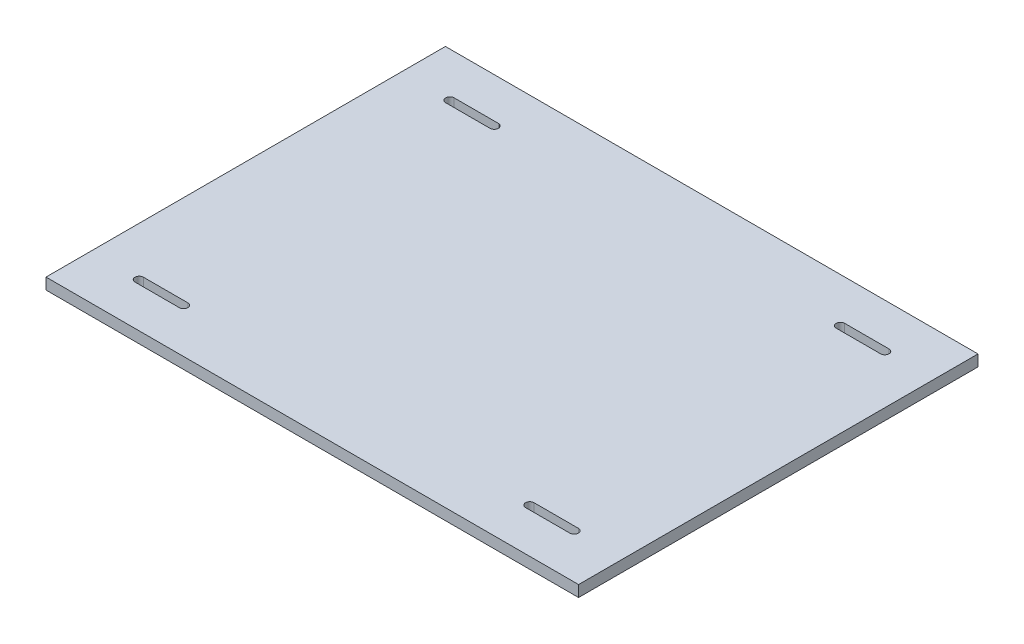
ISO-10303-21;
HEADER;
FILE_DESCRIPTION(('STEP AP214'),'2;1');
FILE_NAME('part.step','',(''),(''),'','','');
FILE_SCHEMA(('AUTOMOTIVE_DESIGN { 1 0 10303 214 1 1 1 1 }'));
ENDSEC;
DATA;
#1=APPLICATION_CONTEXT('core data for automotive mechanical design processes');
#2=APPLICATION_PROTOCOL_DEFINITION('international standard','automotive_design',2000,#1);
#3=PRODUCT_CONTEXT('',#1,'mechanical');
#4=PRODUCT('Part','Part','',(#3));
#5=PRODUCT_RELATED_PRODUCT_CATEGORY('part','',(#4));
#6=PRODUCT_DEFINITION_FORMATION('','',#4);
#7=PRODUCT_DEFINITION_CONTEXT('part definition',#1,'design');
#8=PRODUCT_DEFINITION('design','',#6,#7);
#9=PRODUCT_DEFINITION_SHAPE('','',#8);
#10=(LENGTH_UNIT() NAMED_UNIT(*) SI_UNIT(.MILLI.,.METRE.));
#11=(NAMED_UNIT(*) PLANE_ANGLE_UNIT() SI_UNIT($,.RADIAN.));
#12=(NAMED_UNIT(*) SI_UNIT($,.STERADIAN.) SOLID_ANGLE_UNIT());
#13=UNCERTAINTY_MEASURE_WITH_UNIT(LENGTH_MEASURE(1.E-05),#10,'distance_accuracy_value','');
#14=(GEOMETRIC_REPRESENTATION_CONTEXT(3) GLOBAL_UNCERTAINTY_ASSIGNED_CONTEXT((#13)) GLOBAL_UNIT_ASSIGNED_CONTEXT((#10,
#11,#12)) REPRESENTATION_CONTEXT('',''));
#15=CARTESIAN_POINT('',(0.,0.,0.));
#16=DIRECTION('',(0.,0.,1.));
#17=DIRECTION('',(1.,0.,0.));
#18=AXIS2_PLACEMENT_3D('',#15,#16,#17);
#19=CARTESIAN_POINT('',(600.,25.4,450.));
#20=DIRECTION('',(-1.,0.,0.));
#21=DIRECTION('',(0.,0.,1.));
#22=AXIS2_PLACEMENT_3D('',#19,#20,#21);
#23=PLANE('',#22);
#24=DIRECTION('',(0.,0.,-1.));
#25=VECTOR('',#24,1.);
#26=CARTESIAN_POINT('',(600.,0.,450.));
#27=LINE('',#26,#25);
#28=CARTESIAN_POINT('',(600.,0.,450.));
#29=VERTEX_POINT('',#28);
#30=CARTESIAN_POINT('',(600.,0.,-450.));
#31=VERTEX_POINT('',#30);
#32=EDGE_CURVE('E300',#29,#31,#27,.T.);
#33=ORIENTED_EDGE('',*,*,#32,.T.);
#34=DIRECTION('',(0.,-1.,0.));
#35=VECTOR('',#34,1.);
#36=CARTESIAN_POINT('',(600.,25.4,-450.));
#37=LINE('',#36,#35);
#38=CARTESIAN_POINT('',(600.,25.4,-450.));
#39=VERTEX_POINT('',#38);
#40=EDGE_CURVE('E11',#39,#31,#37,.T.);
#41=ORIENTED_EDGE('',*,*,#40,.F.);
#42=DIRECTION('',(0.,0.,-1.));
#43=VECTOR('',#42,1.);
#44=CARTESIAN_POINT('',(600.,25.4,450.));
#45=LINE('',#44,#43);
#46=CARTESIAN_POINT('',(600.,25.4,450.));
#47=VERTEX_POINT('',#46);
#48=EDGE_CURVE('E307',#47,#39,#45,.T.);
#49=ORIENTED_EDGE('',*,*,#48,.F.);
#50=DIRECTION('',(0.,-1.,0.));
#51=VECTOR('',#50,1.);
#52=CARTESIAN_POINT('',(600.,25.4,450.));
#53=LINE('',#52,#51);
#54=EDGE_CURVE('E317',#47,#29,#53,.T.);
#55=ORIENTED_EDGE('',*,*,#54,.T.);
#56=EDGE_LOOP('',(#33,#41,#49,#55));
#57=FACE_BOUND('',#56,.T.);
#58=ADVANCED_FACE('F37',(#57),#23,.F.);
#59=CARTESIAN_POINT('',(-600.,25.4,-450.));
#60=DIRECTION('',(0.,0.,1.));
#61=DIRECTION('',(1.,0.,0.));
#62=AXIS2_PLACEMENT_3D('',#59,#60,#61);
#63=PLANE('',#62);
#64=DIRECTION('',(-1.,0.,0.));
#65=VECTOR('',#64,1.);
#66=CARTESIAN_POINT('',(-600.,0.,-450.));
#67=LINE('',#66,#65);
#68=CARTESIAN_POINT('',(-600.,0.,-450.));
#69=VERTEX_POINT('',#68);
#70=EDGE_CURVE('E320',#31,#69,#67,.T.);
#71=ORIENTED_EDGE('',*,*,#70,.T.);
#72=DIRECTION('',(0.,-1.,0.));
#73=VECTOR('',#72,1.);
#74=CARTESIAN_POINT('',(-600.,25.4,-450.));
#75=LINE('',#74,#73);
#76=CARTESIAN_POINT('',(-600.,25.4,-450.));
#77=VERTEX_POINT('',#76);
#78=EDGE_CURVE('E44',#77,#69,#75,.T.);
#79=ORIENTED_EDGE('',*,*,#78,.F.);
#80=DIRECTION('',(-1.,0.,0.));
#81=VECTOR('',#80,1.);
#82=CARTESIAN_POINT('',(-600.,25.4,-450.));
#83=LINE('',#82,#81);
#84=EDGE_CURVE('E310',#39,#77,#83,.T.);
#85=ORIENTED_EDGE('',*,*,#84,.F.);
#86=ORIENTED_EDGE('',*,*,#40,.T.);
#87=EDGE_LOOP('',(#71,#79,#85,#86));
#88=FACE_BOUND('',#87,.T.);
#89=ADVANCED_FACE('F349',(#88),#63,.F.);
#90=CARTESIAN_POINT('',(-600.,25.4,450.));
#91=DIRECTION('',(1.,0.,0.));
#92=DIRECTION('',(0.,0.,-1.));
#93=AXIS2_PLACEMENT_3D('',#90,#91,#92);
#94=PLANE('',#93);
#95=DIRECTION('',(0.,0.,1.));
#96=VECTOR('',#95,1.);
#97=CARTESIAN_POINT('',(-600.,0.,450.));
#98=LINE('',#97,#96);
#99=CARTESIAN_POINT('',(-600.,0.,450.));
#100=VERTEX_POINT('',#99);
#101=EDGE_CURVE('E322',#69,#100,#98,.T.);
#102=ORIENTED_EDGE('',*,*,#101,.T.);
#103=DIRECTION('',(0.,-1.,0.));
#104=VECTOR('',#103,1.);
#105=CARTESIAN_POINT('',(-600.,25.4,450.));
#106=LINE('',#105,#104);
#107=CARTESIAN_POINT('',(-600.,25.4,450.));
#108=VERTEX_POINT('',#107);
#109=EDGE_CURVE('E327',#108,#100,#106,.T.);
#110=ORIENTED_EDGE('',*,*,#109,.F.);
#111=DIRECTION('',(0.,0.,1.));
#112=VECTOR('',#111,1.);
#113=CARTESIAN_POINT('',(-600.,25.4,450.));
#114=LINE('',#113,#112);
#115=EDGE_CURVE('E313',#77,#108,#114,.T.);
#116=ORIENTED_EDGE('',*,*,#115,.F.);
#117=ORIENTED_EDGE('',*,*,#78,.T.);
#118=EDGE_LOOP('',(#102,#110,#116,#117));
#119=FACE_BOUND('',#118,.T.);
#120=ADVANCED_FACE('F334',(#119),#94,.F.);
#121=CARTESIAN_POINT('',(-600.,25.4,450.));
#122=DIRECTION('',(0.,0.,-1.));
#123=DIRECTION('',(-1.,0.,0.));
#124=AXIS2_PLACEMENT_3D('',#121,#122,#123);
#125=PLANE('',#124);
#126=DIRECTION('',(1.,0.,0.));
#127=VECTOR('',#126,1.);
#128=CARTESIAN_POINT('',(-600.,0.,450.));
#129=LINE('',#128,#127);
#130=EDGE_CURVE('E311',#100,#29,#129,.T.);
#131=ORIENTED_EDGE('',*,*,#130,.T.);
#132=ORIENTED_EDGE('',*,*,#54,.F.);
#133=DIRECTION('',(1.,0.,0.));
#134=VECTOR('',#133,1.);
#135=CARTESIAN_POINT('',(-600.,25.4,450.));
#136=LINE('',#135,#134);
#137=EDGE_CURVE('E315',#108,#47,#136,.T.);
#138=ORIENTED_EDGE('',*,*,#137,.F.);
#139=ORIENTED_EDGE('',*,*,#109,.T.);
#140=EDGE_LOOP('',(#131,#132,#138,#139));
#141=FACE_BOUND('',#140,.T.);
#142=ADVANCED_FACE('F342',(#141),#125,.F.);
#143=CARTESIAN_POINT('',(0.,25.4,0.));
#144=DIRECTION('',(0.,-1.,0.));
#145=DIRECTION('',(0.,0.,-1.));
#146=AXIS2_PLACEMENT_3D('',#143,#144,#145);
#147=PLANE('',#146);
#148=DIRECTION('',(-1.,0.,0.));
#149=VECTOR('',#148,1.);
#150=CARTESIAN_POINT('',(-390.,25.4,-359.525));
#151=LINE('',#150,#149);
#152=CARTESIAN_POINT('',(-390.,25.4,-359.525));
#153=VERTEX_POINT('',#152);
#154=CARTESIAN_POINT('',(-490.,25.4,-359.525));
#155=VERTEX_POINT('',#154);
#156=EDGE_CURVE('E203',#153,#155,#151,.T.);
#157=ORIENTED_EDGE('',*,*,#156,.F.);
#158=CARTESIAN_POINT('',(-390.,25.4,-350.));
#159=DIRECTION('',(0.,1.,0.));
#160=DIRECTION('',(0.,0.,-1.));
#161=AXIS2_PLACEMENT_3D('',#158,#159,#160);
#162=CIRCLE('',#161,9.52500000000001);
#163=CARTESIAN_POINT('',(-390.,25.4,-340.475));
#164=VERTEX_POINT('',#163);
#165=EDGE_CURVE('E51',#164,#153,#162,.T.);
#166=ORIENTED_EDGE('',*,*,#165,.F.);
#167=DIRECTION('',(1.,0.,0.));
#168=VECTOR('',#167,1.);
#169=CARTESIAN_POINT('',(-390.,25.4,-340.475));
#170=LINE('',#169,#168);
#171=CARTESIAN_POINT('',(-490.,25.4,-340.475));
#172=VERTEX_POINT('',#171);
#173=EDGE_CURVE('E194',#172,#164,#170,.T.);
#174=ORIENTED_EDGE('',*,*,#173,.F.);
#175=CARTESIAN_POINT('',(-490.,25.4,-350.));
#176=DIRECTION('',(0.,1.,0.));
#177=DIRECTION('',(0.,0.,1.));
#178=AXIS2_PLACEMENT_3D('',#175,#176,#177);
#179=CIRCLE('',#178,9.52500000000001);
#180=EDGE_CURVE('E197',#155,#172,#179,.T.);
#181=ORIENTED_EDGE('',*,*,#180,.F.);
#182=EDGE_LOOP('',(#157,#166,#174,#181));
#183=FACE_BOUND('',#182,.T.);
#184=DIRECTION('',(1.,0.,0.));
#185=VECTOR('',#184,1.);
#186=CARTESIAN_POINT('',(390.,25.4,359.525));
#187=LINE('',#186,#185);
#188=CARTESIAN_POINT('',(390.,25.4,359.525));
#189=VERTEX_POINT('',#188);
#190=CARTESIAN_POINT('',(490.,25.4,359.525));
#191=VERTEX_POINT('',#190);
#192=EDGE_CURVE('E229',#189,#191,#187,.T.);
#193=ORIENTED_EDGE('',*,*,#192,.F.);
#194=CARTESIAN_POINT('',(390.,25.4,350.));
#195=DIRECTION('',(0.,1.,0.));
#196=DIRECTION('',(0.,0.,-1.));
#197=AXIS2_PLACEMENT_3D('',#194,#195,#196);
#198=CIRCLE('',#197,9.52500000000001);
#199=CARTESIAN_POINT('',(390.,25.4,340.475));
#200=VERTEX_POINT('',#199);
#201=EDGE_CURVE('E59',#200,#189,#198,.T.);
#202=ORIENTED_EDGE('',*,*,#201,.F.);
#203=DIRECTION('',(-1.,0.,0.));
#204=VECTOR('',#203,1.);
#205=CARTESIAN_POINT('',(390.,25.4,340.475));
#206=LINE('',#205,#204);
#207=CARTESIAN_POINT('',(490.,25.4,340.475));
#208=VERTEX_POINT('',#207);
#209=EDGE_CURVE('E218',#208,#200,#206,.T.);
#210=ORIENTED_EDGE('',*,*,#209,.F.);
#211=CARTESIAN_POINT('',(490.,25.4,350.));
#212=DIRECTION('',(0.,1.,0.));
#213=DIRECTION('',(0.,0.,1.));
#214=AXIS2_PLACEMENT_3D('',#211,#212,#213);
#215=CIRCLE('',#214,9.52500000000001);
#216=EDGE_CURVE('E233',#191,#208,#215,.T.);
#217=ORIENTED_EDGE('',*,*,#216,.F.);
#218=EDGE_LOOP('',(#193,#202,#210,#217));
#219=FACE_BOUND('',#218,.T.);
#220=DIRECTION('',(-1.,0.,0.));
#221=VECTOR('',#220,1.);
#222=CARTESIAN_POINT('',(-390.,25.4,340.475));
#223=LINE('',#222,#221);
#224=CARTESIAN_POINT('',(-390.,25.4,340.475));
#225=VERTEX_POINT('',#224);
#226=CARTESIAN_POINT('',(-490.,25.4,340.475));
#227=VERTEX_POINT('',#226);
#228=EDGE_CURVE('E260',#225,#227,#223,.T.);
#229=ORIENTED_EDGE('',*,*,#228,.F.);
#230=CARTESIAN_POINT('',(-390.,25.4,350.));
#231=DIRECTION('',(0.,1.,0.));
#232=DIRECTION('',(0.,0.,1.));
#233=AXIS2_PLACEMENT_3D('',#230,#231,#232);
#234=CIRCLE('',#233,9.52500000000001);
#235=CARTESIAN_POINT('',(-390.,25.4,359.525));
#236=VERTEX_POINT('',#235);
#237=EDGE_CURVE('E258',#236,#225,#234,.T.);
#238=ORIENTED_EDGE('',*,*,#237,.F.);
#239=DIRECTION('',(1.,0.,0.));
#240=VECTOR('',#239,1.);
#241=CARTESIAN_POINT('',(-390.,25.4,359.525));
#242=LINE('',#241,#240);
#243=CARTESIAN_POINT('',(-490.,25.4,359.525));
#244=VERTEX_POINT('',#243);
#245=EDGE_CURVE('E248',#244,#236,#242,.T.);
#246=ORIENTED_EDGE('',*,*,#245,.F.);
#247=CARTESIAN_POINT('',(-490.,25.4,350.));
#248=DIRECTION('',(0.,1.,0.));
#249=DIRECTION('',(0.,0.,-1.));
#250=AXIS2_PLACEMENT_3D('',#247,#248,#249);
#251=CIRCLE('',#250,9.52500000000001);
#252=EDGE_CURVE('E263',#227,#244,#251,.T.);
#253=ORIENTED_EDGE('',*,*,#252,.F.);
#254=EDGE_LOOP('',(#229,#238,#246,#253));
#255=FACE_BOUND('',#254,.T.);
#256=DIRECTION('',(-1.,0.,0.));
#257=VECTOR('',#256,1.);
#258=CARTESIAN_POINT('',(390.,25.4,-359.525));
#259=LINE('',#258,#257);
#260=CARTESIAN_POINT('',(490.,25.4,-359.525));
#261=VERTEX_POINT('',#260);
#262=CARTESIAN_POINT('',(390.,25.4,-359.525));
#263=VERTEX_POINT('',#262);
#264=EDGE_CURVE('E290',#261,#263,#259,.T.);
#265=ORIENTED_EDGE('',*,*,#264,.F.);
#266=CARTESIAN_POINT('',(490.,25.4,-350.));
#267=DIRECTION('',(0.,1.,0.));
#268=DIRECTION('',(0.,0.,-1.));
#269=AXIS2_PLACEMENT_3D('',#266,#267,#268);
#270=CIRCLE('',#269,9.52500000000001);
#271=CARTESIAN_POINT('',(490.,25.4,-340.475));
#272=VERTEX_POINT('',#271);
#273=EDGE_CURVE('E210',#272,#261,#270,.T.);
#274=ORIENTED_EDGE('',*,*,#273,.F.);
#275=DIRECTION('',(1.,0.,0.));
#276=VECTOR('',#275,1.);
#277=CARTESIAN_POINT('',(390.,25.4,-340.475));
#278=LINE('',#277,#276);
#279=CARTESIAN_POINT('',(390.,25.4,-340.475));
#280=VERTEX_POINT('',#279);
#281=EDGE_CURVE('E279',#280,#272,#278,.T.);
#282=ORIENTED_EDGE('',*,*,#281,.F.);
#283=CARTESIAN_POINT('',(390.,25.4,-350.));
#284=DIRECTION('',(0.,1.,0.));
#285=DIRECTION('',(0.,0.,1.));
#286=AXIS2_PLACEMENT_3D('',#283,#284,#285);
#287=CIRCLE('',#286,9.52500000000001);
#288=EDGE_CURVE('E293',#263,#280,#287,.T.);
#289=ORIENTED_EDGE('',*,*,#288,.F.);
#290=EDGE_LOOP('',(#265,#274,#282,#289));
#291=FACE_BOUND('',#290,.T.);
#292=ORIENTED_EDGE('',*,*,#48,.T.);
#293=ORIENTED_EDGE('',*,*,#84,.T.);
#294=ORIENTED_EDGE('',*,*,#115,.T.);
#295=ORIENTED_EDGE('',*,*,#137,.T.);
#296=EDGE_LOOP('',(#292,#293,#294,#295));
#297=FACE_BOUND('',#296,.T.);
#298=ADVANCED_FACE('F348',(#183,#219,#255,#291,#297),#147,.F.);
#299=CARTESIAN_POINT('',(0.,0.,0.));
#300=DIRECTION('',(0.,-1.,0.));
#301=DIRECTION('',(0.,0.,-1.));
#302=AXIS2_PLACEMENT_3D('',#299,#300,#301);
#303=PLANE('',#302);
#304=CARTESIAN_POINT('',(-390.,0.,-350.));
#305=DIRECTION('',(0.,1.,0.));
#306=DIRECTION('',(0.,0.,-1.));
#307=AXIS2_PLACEMENT_3D('',#304,#305,#306);
#308=CIRCLE('',#307,9.52500000000001);
#309=CARTESIAN_POINT('',(-390.,0.,-340.475));
#310=VERTEX_POINT('',#309);
#311=CARTESIAN_POINT('',(-390.,0.,-359.525));
#312=VERTEX_POINT('',#311);
#313=EDGE_CURVE('E175',#310,#312,#308,.T.);
#314=ORIENTED_EDGE('',*,*,#313,.T.);
#315=DIRECTION('',(-1.,0.,0.));
#316=VECTOR('',#315,1.);
#317=CARTESIAN_POINT('',(-390.,0.,-359.525));
#318=LINE('',#317,#316);
#319=CARTESIAN_POINT('',(-490.,0.,-359.525));
#320=VERTEX_POINT('',#319);
#321=EDGE_CURVE('E185',#312,#320,#318,.T.);
#322=ORIENTED_EDGE('',*,*,#321,.T.);
#323=CARTESIAN_POINT('',(-490.,0.,-350.));
#324=DIRECTION('',(0.,1.,0.));
#325=DIRECTION('',(0.,0.,1.));
#326=AXIS2_PLACEMENT_3D('',#323,#324,#325);
#327=CIRCLE('',#326,9.52500000000001);
#328=CARTESIAN_POINT('',(-490.,0.,-340.475));
#329=VERTEX_POINT('',#328);
#330=EDGE_CURVE('E189',#320,#329,#327,.T.);
#331=ORIENTED_EDGE('',*,*,#330,.T.);
#332=DIRECTION('',(1.,0.,0.));
#333=VECTOR('',#332,1.);
#334=CARTESIAN_POINT('',(-390.,0.,-340.475));
#335=LINE('',#334,#333);
#336=EDGE_CURVE('E181',#329,#310,#335,.T.);
#337=ORIENTED_EDGE('',*,*,#336,.T.);
#338=EDGE_LOOP('',(#314,#322,#331,#337));
#339=FACE_BOUND('',#338,.T.);
#340=CARTESIAN_POINT('',(390.,0.,350.));
#341=DIRECTION('',(0.,1.,0.));
#342=DIRECTION('',(0.,0.,-1.));
#343=AXIS2_PLACEMENT_3D('',#340,#341,#342);
#344=CIRCLE('',#343,9.52500000000001);
#345=CARTESIAN_POINT('',(390.,0.,340.475));
#346=VERTEX_POINT('',#345);
#347=CARTESIAN_POINT('',(390.,0.,359.525));
#348=VERTEX_POINT('',#347);
#349=EDGE_CURVE('E214',#346,#348,#344,.T.);
#350=ORIENTED_EDGE('',*,*,#349,.T.);
#351=DIRECTION('',(1.,0.,0.));
#352=VECTOR('',#351,1.);
#353=CARTESIAN_POINT('',(390.,0.,359.525));
#354=LINE('',#353,#352);
#355=CARTESIAN_POINT('',(490.,0.,359.525));
#356=VERTEX_POINT('',#355);
#357=EDGE_CURVE('E217',#348,#356,#354,.T.);
#358=ORIENTED_EDGE('',*,*,#357,.T.);
#359=CARTESIAN_POINT('',(490.,0.,350.));
#360=DIRECTION('',(0.,1.,0.));
#361=DIRECTION('',(0.,0.,1.));
#362=AXIS2_PLACEMENT_3D('',#359,#360,#361);
#363=CIRCLE('',#362,9.52500000000001);
#364=CARTESIAN_POINT('',(490.,0.,340.475));
#365=VERTEX_POINT('',#364);
#366=EDGE_CURVE('E221',#356,#365,#363,.T.);
#367=ORIENTED_EDGE('',*,*,#366,.T.);
#368=DIRECTION('',(-1.,0.,0.));
#369=VECTOR('',#368,1.);
#370=CARTESIAN_POINT('',(390.,0.,340.475));
#371=LINE('',#370,#369);
#372=EDGE_CURVE('E224',#365,#346,#371,.T.);
#373=ORIENTED_EDGE('',*,*,#372,.T.);
#374=EDGE_LOOP('',(#350,#358,#367,#373));
#375=FACE_BOUND('',#374,.T.);
#376=CARTESIAN_POINT('',(-390.,0.,350.));
#377=DIRECTION('',(0.,1.,0.));
#378=DIRECTION('',(0.,0.,1.));
#379=AXIS2_PLACEMENT_3D('',#376,#377,#378);
#380=CIRCLE('',#379,9.52500000000001);
#381=CARTESIAN_POINT('',(-390.,0.,359.525));
#382=VERTEX_POINT('',#381);
#383=CARTESIAN_POINT('',(-390.,0.,340.475));
#384=VERTEX_POINT('',#383);
#385=EDGE_CURVE('E244',#382,#384,#380,.T.);
#386=ORIENTED_EDGE('',*,*,#385,.T.);
#387=DIRECTION('',(-1.,0.,0.));
#388=VECTOR('',#387,1.);
#389=CARTESIAN_POINT('',(-390.,0.,340.475));
#390=LINE('',#389,#388);
#391=CARTESIAN_POINT('',(-490.,0.,340.475));
#392=VERTEX_POINT('',#391);
#393=EDGE_CURVE('E247',#384,#392,#390,.T.);
#394=ORIENTED_EDGE('',*,*,#393,.T.);
#395=CARTESIAN_POINT('',(-490.,0.,350.));
#396=DIRECTION('',(0.,1.,0.));
#397=DIRECTION('',(0.,0.,-1.));
#398=AXIS2_PLACEMENT_3D('',#395,#396,#397);
#399=CIRCLE('',#398,9.52500000000001);
#400=CARTESIAN_POINT('',(-490.,0.,359.525));
#401=VERTEX_POINT('',#400);
#402=EDGE_CURVE('E251',#392,#401,#399,.T.);
#403=ORIENTED_EDGE('',*,*,#402,.T.);
#404=DIRECTION('',(1.,0.,0.));
#405=VECTOR('',#404,1.);
#406=CARTESIAN_POINT('',(-390.,0.,359.525));
#407=LINE('',#406,#405);
#408=EDGE_CURVE('E254',#401,#382,#407,.T.);
#409=ORIENTED_EDGE('',*,*,#408,.T.);
#410=EDGE_LOOP('',(#386,#394,#403,#409));
#411=FACE_BOUND('',#410,.T.);
#412=CARTESIAN_POINT('',(490.,0.,-350.));
#413=DIRECTION('',(0.,1.,0.));
#414=DIRECTION('',(0.,0.,-1.));
#415=AXIS2_PLACEMENT_3D('',#412,#413,#414);
#416=CIRCLE('',#415,9.52500000000001);
#417=CARTESIAN_POINT('',(490.,0.,-340.475));
#418=VERTEX_POINT('',#417);
#419=CARTESIAN_POINT('',(490.,0.,-359.525));
#420=VERTEX_POINT('',#419);
#421=EDGE_CURVE('E275',#418,#420,#416,.T.);
#422=ORIENTED_EDGE('',*,*,#421,.T.);
#423=DIRECTION('',(-1.,0.,0.));
#424=VECTOR('',#423,1.);
#425=CARTESIAN_POINT('',(390.,0.,-359.525));
#426=LINE('',#425,#424);
#427=CARTESIAN_POINT('',(390.,0.,-359.525));
#428=VERTEX_POINT('',#427);
#429=EDGE_CURVE('E278',#420,#428,#426,.T.);
#430=ORIENTED_EDGE('',*,*,#429,.T.);
#431=CARTESIAN_POINT('',(390.,0.,-350.));
#432=DIRECTION('',(0.,1.,0.));
#433=DIRECTION('',(0.,0.,1.));
#434=AXIS2_PLACEMENT_3D('',#431,#432,#433);
#435=CIRCLE('',#434,9.52500000000001);
#436=CARTESIAN_POINT('',(390.,0.,-340.475));
#437=VERTEX_POINT('',#436);
#438=EDGE_CURVE('E282',#428,#437,#435,.T.);
#439=ORIENTED_EDGE('',*,*,#438,.T.);
#440=DIRECTION('',(1.,0.,0.));
#441=VECTOR('',#440,1.);
#442=CARTESIAN_POINT('',(390.,0.,-340.475));
#443=LINE('',#442,#441);
#444=EDGE_CURVE('E285',#437,#418,#443,.T.);
#445=ORIENTED_EDGE('',*,*,#444,.T.);
#446=EDGE_LOOP('',(#422,#430,#439,#445));
#447=FACE_BOUND('',#446,.T.);
#448=ORIENTED_EDGE('',*,*,#32,.F.);
#449=ORIENTED_EDGE('',*,*,#130,.F.);
#450=ORIENTED_EDGE('',*,*,#101,.F.);
#451=ORIENTED_EDGE('',*,*,#70,.F.);
#452=EDGE_LOOP('',(#448,#449,#450,#451));
#453=FACE_BOUND('',#452,.T.);
#454=ADVANCED_FACE('F191',(#339,#375,#411,#447,#453),#303,.T.);
#455=CARTESIAN_POINT('',(490.,0.,-350.));
#456=DIRECTION('',(0.,1.,0.));
#457=DIRECTION('',(0.,0.,1.));
#458=AXIS2_PLACEMENT_3D('',#455,#456,#457);
#459=CYLINDRICAL_SURFACE('',#458,9.52500000000001);
#460=ORIENTED_EDGE('',*,*,#273,.T.);
#461=DIRECTION('',(0.,1.,0.));
#462=VECTOR('',#461,1.);
#463=CARTESIAN_POINT('',(490.,0.,-359.525));
#464=LINE('',#463,#462);
#465=EDGE_CURVE('E288',#420,#261,#464,.T.);
#466=ORIENTED_EDGE('',*,*,#465,.F.);
#467=ORIENTED_EDGE('',*,*,#421,.F.);
#468=DIRECTION('',(0.,1.,0.));
#469=VECTOR('',#468,1.);
#470=CARTESIAN_POINT('',(490.,0.,-340.475));
#471=LINE('',#470,#469);
#472=EDGE_CURVE('E298',#418,#272,#471,.T.);
#473=ORIENTED_EDGE('',*,*,#472,.T.);
#474=EDGE_LOOP('',(#460,#466,#467,#473));
#475=FACE_BOUND('',#474,.T.);
#476=ADVANCED_FACE('F361',(#475),#459,.F.);
#477=CARTESIAN_POINT('',(390.,0.,-340.475));
#478=DIRECTION('',(0.,0.,1.));
#479=DIRECTION('',(1.,0.,0.));
#480=AXIS2_PLACEMENT_3D('',#477,#478,#479);
#481=PLANE('',#480);
#482=ORIENTED_EDGE('',*,*,#281,.T.);
#483=ORIENTED_EDGE('',*,*,#472,.F.);
#484=ORIENTED_EDGE('',*,*,#444,.F.);
#485=DIRECTION('',(0.,1.,0.));
#486=VECTOR('',#485,1.);
#487=CARTESIAN_POINT('',(390.,0.,-340.475));
#488=LINE('',#487,#486);
#489=EDGE_CURVE('E301',#437,#280,#488,.T.);
#490=ORIENTED_EDGE('',*,*,#489,.T.);
#491=EDGE_LOOP('',(#482,#483,#484,#490));
#492=FACE_BOUND('',#491,.T.);
#493=ADVANCED_FACE('F367',(#492),#481,.F.);
#494=CARTESIAN_POINT('',(390.,0.,-350.));
#495=DIRECTION('',(0.,1.,0.));
#496=DIRECTION('',(0.,0.,1.));
#497=AXIS2_PLACEMENT_3D('',#494,#495,#496);
#498=CYLINDRICAL_SURFACE('',#497,9.52500000000001);
#499=ORIENTED_EDGE('',*,*,#288,.T.);
#500=ORIENTED_EDGE('',*,*,#489,.F.);
#501=ORIENTED_EDGE('',*,*,#438,.F.);
#502=DIRECTION('',(0.,1.,0.));
#503=VECTOR('',#502,1.);
#504=CARTESIAN_POINT('',(390.,0.,-359.525));
#505=LINE('',#504,#503);
#506=EDGE_CURVE('E303',#428,#263,#505,.T.);
#507=ORIENTED_EDGE('',*,*,#506,.T.);
#508=EDGE_LOOP('',(#499,#500,#501,#507));
#509=FACE_BOUND('',#508,.T.);
#510=ADVANCED_FACE('F373',(#509),#498,.F.);
#511=CARTESIAN_POINT('',(390.,0.,-359.525));
#512=DIRECTION('',(0.,0.,-1.));
#513=DIRECTION('',(-1.,0.,0.));
#514=AXIS2_PLACEMENT_3D('',#511,#512,#513);
#515=PLANE('',#514);
#516=ORIENTED_EDGE('',*,*,#264,.T.);
#517=ORIENTED_EDGE('',*,*,#506,.F.);
#518=ORIENTED_EDGE('',*,*,#429,.F.);
#519=ORIENTED_EDGE('',*,*,#465,.T.);
#520=EDGE_LOOP('',(#516,#517,#518,#519));
#521=FACE_BOUND('',#520,.T.);
#522=ADVANCED_FACE('F369',(#521),#515,.F.);
#523=CARTESIAN_POINT('',(-390.,0.,350.));
#524=DIRECTION('',(0.,1.,0.));
#525=DIRECTION('',(0.,0.,1.));
#526=AXIS2_PLACEMENT_3D('',#523,#524,#525);
#527=CYLINDRICAL_SURFACE('',#526,9.52500000000001);
#528=ORIENTED_EDGE('',*,*,#237,.T.);
#529=DIRECTION('',(0.,1.,0.));
#530=VECTOR('',#529,1.);
#531=CARTESIAN_POINT('',(-390.,0.,340.475));
#532=LINE('',#531,#530);
#533=EDGE_CURVE('E257',#384,#225,#532,.T.);
#534=ORIENTED_EDGE('',*,*,#533,.F.);
#535=ORIENTED_EDGE('',*,*,#385,.F.);
#536=DIRECTION('',(0.,1.,0.));
#537=VECTOR('',#536,1.);
#538=CARTESIAN_POINT('',(-390.,0.,359.525));
#539=LINE('',#538,#537);
#540=EDGE_CURVE('E230',#382,#236,#539,.T.);
#541=ORIENTED_EDGE('',*,*,#540,.T.);
#542=EDGE_LOOP('',(#528,#534,#535,#541));
#543=FACE_BOUND('',#542,.T.);
#544=ADVANCED_FACE('F372',(#543),#527,.F.);
#545=CARTESIAN_POINT('',(-390.,0.,359.525));
#546=DIRECTION('',(0.,0.,1.));
#547=DIRECTION('',(1.,0.,0.));
#548=AXIS2_PLACEMENT_3D('',#545,#546,#547);
#549=PLANE('',#548);
#550=ORIENTED_EDGE('',*,*,#245,.T.);
#551=ORIENTED_EDGE('',*,*,#540,.F.);
#552=ORIENTED_EDGE('',*,*,#408,.F.);
#553=DIRECTION('',(0.,1.,0.));
#554=VECTOR('',#553,1.);
#555=CARTESIAN_POINT('',(-490.,0.,359.525));
#556=LINE('',#555,#554);
#557=EDGE_CURVE('E269',#401,#244,#556,.T.);
#558=ORIENTED_EDGE('',*,*,#557,.T.);
#559=EDGE_LOOP('',(#550,#551,#552,#558));
#560=FACE_BOUND('',#559,.T.);
#561=ADVANCED_FACE('F383',(#560),#549,.F.);
#562=CARTESIAN_POINT('',(-490.,0.,350.));
#563=DIRECTION('',(0.,1.,0.));
#564=DIRECTION('',(0.,0.,1.));
#565=AXIS2_PLACEMENT_3D('',#562,#563,#564);
#566=CYLINDRICAL_SURFACE('',#565,9.52500000000001);
#567=ORIENTED_EDGE('',*,*,#252,.T.);
#568=ORIENTED_EDGE('',*,*,#557,.F.);
#569=ORIENTED_EDGE('',*,*,#402,.F.);
#570=DIRECTION('',(0.,1.,0.));
#571=VECTOR('',#570,1.);
#572=CARTESIAN_POINT('',(-490.,0.,340.475));
#573=LINE('',#572,#571);
#574=EDGE_CURVE('E271',#392,#227,#573,.T.);
#575=ORIENTED_EDGE('',*,*,#574,.T.);
#576=EDGE_LOOP('',(#567,#568,#569,#575));
#577=FACE_BOUND('',#576,.T.);
#578=ADVANCED_FACE('F389',(#577),#566,.F.);
#579=CARTESIAN_POINT('',(-390.,0.,340.475));
#580=DIRECTION('',(0.,0.,-1.));
#581=DIRECTION('',(-1.,0.,0.));
#582=AXIS2_PLACEMENT_3D('',#579,#580,#581);
#583=PLANE('',#582);
#584=ORIENTED_EDGE('',*,*,#228,.T.);
#585=ORIENTED_EDGE('',*,*,#574,.F.);
#586=ORIENTED_EDGE('',*,*,#393,.F.);
#587=ORIENTED_EDGE('',*,*,#533,.T.);
#588=EDGE_LOOP('',(#584,#585,#586,#587));
#589=FACE_BOUND('',#588,.T.);
#590=ADVANCED_FACE('F385',(#589),#583,.F.);
#591=CARTESIAN_POINT('',(390.,0.,350.));
#592=DIRECTION('',(0.,1.,0.));
#593=DIRECTION('',(0.,0.,1.));
#594=AXIS2_PLACEMENT_3D('',#591,#592,#593);
#595=CYLINDRICAL_SURFACE('',#594,9.52500000000001);
#596=ORIENTED_EDGE('',*,*,#201,.T.);
#597=DIRECTION('',(0.,1.,0.));
#598=VECTOR('',#597,1.);
#599=CARTESIAN_POINT('',(390.,0.,359.525));
#600=LINE('',#599,#598);
#601=EDGE_CURVE('E227',#348,#189,#600,.T.);
#602=ORIENTED_EDGE('',*,*,#601,.F.);
#603=ORIENTED_EDGE('',*,*,#349,.F.);
#604=DIRECTION('',(0.,1.,0.));
#605=VECTOR('',#604,1.);
#606=CARTESIAN_POINT('',(390.,0.,340.475));
#607=LINE('',#606,#605);
#608=EDGE_CURVE('E204',#346,#200,#607,.T.);
#609=ORIENTED_EDGE('',*,*,#608,.T.);
#610=EDGE_LOOP('',(#596,#602,#603,#609));
#611=FACE_BOUND('',#610,.T.);
#612=ADVANCED_FACE('F388',(#611),#595,.F.);
#613=CARTESIAN_POINT('',(390.,0.,340.475));
#614=DIRECTION('',(0.,0.,-1.));
#615=DIRECTION('',(-1.,0.,0.));
#616=AXIS2_PLACEMENT_3D('',#613,#614,#615);
#617=PLANE('',#616);
#618=ORIENTED_EDGE('',*,*,#209,.T.);
#619=ORIENTED_EDGE('',*,*,#608,.F.);
#620=ORIENTED_EDGE('',*,*,#372,.F.);
#621=DIRECTION('',(0.,1.,0.));
#622=VECTOR('',#621,1.);
#623=CARTESIAN_POINT('',(490.,0.,340.475));
#624=LINE('',#623,#622);
#625=EDGE_CURVE('E239',#365,#208,#624,.T.);
#626=ORIENTED_EDGE('',*,*,#625,.T.);
#627=EDGE_LOOP('',(#618,#619,#620,#626));
#628=FACE_BOUND('',#627,.T.);
#629=ADVANCED_FACE('F399',(#628),#617,.F.);
#630=CARTESIAN_POINT('',(490.,0.,350.));
#631=DIRECTION('',(0.,1.,0.));
#632=DIRECTION('',(0.,0.,1.));
#633=AXIS2_PLACEMENT_3D('',#630,#631,#632);
#634=CYLINDRICAL_SURFACE('',#633,9.52500000000001);
#635=ORIENTED_EDGE('',*,*,#216,.T.);
#636=ORIENTED_EDGE('',*,*,#625,.F.);
#637=ORIENTED_EDGE('',*,*,#366,.F.);
#638=DIRECTION('',(0.,1.,0.));
#639=VECTOR('',#638,1.);
#640=CARTESIAN_POINT('',(490.,0.,359.525));
#641=LINE('',#640,#639);
#642=EDGE_CURVE('E241',#356,#191,#641,.T.);
#643=ORIENTED_EDGE('',*,*,#642,.T.);
#644=EDGE_LOOP('',(#635,#636,#637,#643));
#645=FACE_BOUND('',#644,.T.);
#646=ADVANCED_FACE('F403',(#645),#634,.F.);
#647=CARTESIAN_POINT('',(390.,0.,359.525));
#648=DIRECTION('',(0.,0.,1.));
#649=DIRECTION('',(1.,0.,0.));
#650=AXIS2_PLACEMENT_3D('',#647,#648,#649);
#651=PLANE('',#650);
#652=ORIENTED_EDGE('',*,*,#192,.T.);
#653=ORIENTED_EDGE('',*,*,#642,.F.);
#654=ORIENTED_EDGE('',*,*,#357,.F.);
#655=ORIENTED_EDGE('',*,*,#601,.T.);
#656=EDGE_LOOP('',(#652,#653,#654,#655));
#657=FACE_BOUND('',#656,.T.);
#658=ADVANCED_FACE('F400',(#657),#651,.F.);
#659=CARTESIAN_POINT('',(-390.,0.,-350.));
#660=DIRECTION('',(0.,1.,0.));
#661=DIRECTION('',(0.,0.,1.));
#662=AXIS2_PLACEMENT_3D('',#659,#660,#661);
#663=CYLINDRICAL_SURFACE('',#662,9.52500000000001);
#664=ORIENTED_EDGE('',*,*,#165,.T.);
#665=DIRECTION('',(0.,1.,0.));
#666=VECTOR('',#665,1.);
#667=CARTESIAN_POINT('',(-390.,0.,-359.525));
#668=LINE('',#667,#666);
#669=EDGE_CURVE('E171',#312,#153,#668,.T.);
#670=ORIENTED_EDGE('',*,*,#669,.F.);
#671=ORIENTED_EDGE('',*,*,#313,.F.);
#672=DIRECTION('',(0.,1.,0.));
#673=VECTOR('',#672,1.);
#674=CARTESIAN_POINT('',(-390.,0.,-340.475));
#675=LINE('',#674,#673);
#676=EDGE_CURVE('E208',#310,#164,#675,.T.);
#677=ORIENTED_EDGE('',*,*,#676,.T.);
#678=EDGE_LOOP('',(#664,#670,#671,#677));
#679=FACE_BOUND('',#678,.T.);
#680=ADVANCED_FACE('F173',(#679),#663,.F.);
#681=CARTESIAN_POINT('',(-390.,0.,-340.475));
#682=DIRECTION('',(0.,0.,1.));
#683=DIRECTION('',(1.,0.,0.));
#684=AXIS2_PLACEMENT_3D('',#681,#682,#683);
#685=PLANE('',#684);
#686=ORIENTED_EDGE('',*,*,#173,.T.);
#687=ORIENTED_EDGE('',*,*,#676,.F.);
#688=ORIENTED_EDGE('',*,*,#336,.F.);
#689=DIRECTION('',(0.,1.,0.));
#690=VECTOR('',#689,1.);
#691=CARTESIAN_POINT('',(-490.,0.,-340.475));
#692=LINE('',#691,#690);
#693=EDGE_CURVE('E211',#329,#172,#692,.T.);
#694=ORIENTED_EDGE('',*,*,#693,.T.);
#695=EDGE_LOOP('',(#686,#687,#688,#694));
#696=FACE_BOUND('',#695,.T.);
#697=ADVANCED_FACE('F413',(#696),#685,.F.);
#698=CARTESIAN_POINT('',(-490.,0.,-350.));
#699=DIRECTION('',(0.,1.,0.));
#700=DIRECTION('',(0.,0.,1.));
#701=AXIS2_PLACEMENT_3D('',#698,#699,#700);
#702=CYLINDRICAL_SURFACE('',#701,9.52500000000001);
#703=ORIENTED_EDGE('',*,*,#180,.T.);
#704=ORIENTED_EDGE('',*,*,#693,.F.);
#705=ORIENTED_EDGE('',*,*,#330,.F.);
#706=DIRECTION('',(0.,1.,0.));
#707=VECTOR('',#706,1.);
#708=CARTESIAN_POINT('',(-490.,0.,-359.525));
#709=LINE('',#708,#707);
#710=EDGE_CURVE('E180',#320,#155,#709,.T.);
#711=ORIENTED_EDGE('',*,*,#710,.T.);
#712=EDGE_LOOP('',(#703,#704,#705,#711));
#713=FACE_BOUND('',#712,.T.);
#714=ADVANCED_FACE('F416',(#713),#702,.F.);
#715=CARTESIAN_POINT('',(-390.,0.,-359.525));
#716=DIRECTION('',(0.,0.,-1.));
#717=DIRECTION('',(-1.,0.,0.));
#718=AXIS2_PLACEMENT_3D('',#715,#716,#717);
#719=PLANE('',#718);
#720=ORIENTED_EDGE('',*,*,#156,.T.);
#721=ORIENTED_EDGE('',*,*,#710,.F.);
#722=ORIENTED_EDGE('',*,*,#321,.F.);
#723=ORIENTED_EDGE('',*,*,#669,.T.);
#724=EDGE_LOOP('',(#720,#721,#722,#723));
#725=FACE_BOUND('',#724,.T.);
#726=ADVANCED_FACE('F186',(#725),#719,.F.);
#727=CLOSED_SHELL('',(#58,#89,#120,#142,#298,#454,#476,#493,#510,#522,#544,#561,#578,#590,#612,
#629,#646,#658,#680,#697,#714,#726));
#728=MANIFOLD_SOLID_BREP('B2',#727);
#729=ADVANCED_BREP_SHAPE_REPRESENTATION('',(#18,#728),#14);
#730=SHAPE_DEFINITION_REPRESENTATION(#9,#729);
ENDSEC;
END-ISO-10303-21;
